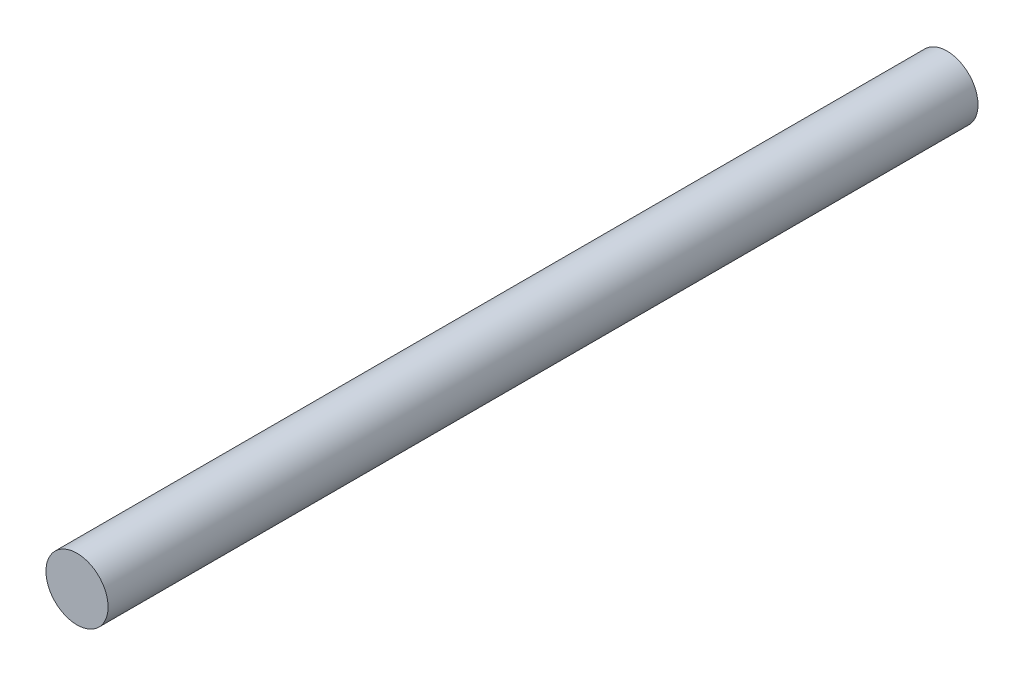
ISO-10303-21;
HEADER;
FILE_DESCRIPTION(('STEP AP214'),'2;1');
FILE_NAME('part.step','',(''),(''),'','','');
FILE_SCHEMA(('AUTOMOTIVE_DESIGN { 1 0 10303 214 1 1 1 1 }'));
ENDSEC;
DATA;
#1=APPLICATION_CONTEXT('core data for automotive mechanical design processes');
#2=APPLICATION_PROTOCOL_DEFINITION('international standard','automotive_design',2000,#1);
#3=PRODUCT_CONTEXT('',#1,'mechanical');
#4=PRODUCT('Part','Part','',(#3));
#5=PRODUCT_RELATED_PRODUCT_CATEGORY('part','',(#4));
#6=PRODUCT_DEFINITION_FORMATION('','',#4);
#7=PRODUCT_DEFINITION_CONTEXT('part definition',#1,'design');
#8=PRODUCT_DEFINITION('design','',#6,#7);
#9=PRODUCT_DEFINITION_SHAPE('','',#8);
#10=(LENGTH_UNIT() NAMED_UNIT(*) SI_UNIT(.MILLI.,.METRE.));
#11=(NAMED_UNIT(*) PLANE_ANGLE_UNIT() SI_UNIT($,.RADIAN.));
#12=(NAMED_UNIT(*) SI_UNIT($,.STERADIAN.) SOLID_ANGLE_UNIT());
#13=UNCERTAINTY_MEASURE_WITH_UNIT(LENGTH_MEASURE(1.E-05),#10,'distance_accuracy_value','');
#14=(GEOMETRIC_REPRESENTATION_CONTEXT(3) GLOBAL_UNCERTAINTY_ASSIGNED_CONTEXT((#13)) GLOBAL_UNIT_ASSIGNED_CONTEXT((#10,
#11,#12)) REPRESENTATION_CONTEXT('',''));
#15=CARTESIAN_POINT('',(0.,0.,0.));
#16=DIRECTION('',(0.,0.,1.));
#17=DIRECTION('',(1.,0.,0.));
#18=AXIS2_PLACEMENT_3D('',#15,#16,#17);
#19=CARTESIAN_POINT('',(0.,0.,70.));
#20=DIRECTION('',(0.,0.,-1.));
#21=DIRECTION('',(-1.,0.,0.));
#22=AXIS2_PLACEMENT_3D('',#19,#20,#21);
#23=CYLINDRICAL_SURFACE('',#22,2.5);
#24=CARTESIAN_POINT('',(0.,0.,70.));
#25=DIRECTION('',(0.,0.,1.));
#26=DIRECTION('',(1.,0.,0.));
#27=AXIS2_PLACEMENT_3D('',#24,#25,#26);
#28=CIRCLE('',#27,2.5);
#29=CARTESIAN_POINT('',(2.5,0.,70.));
#30=VERTEX_POINT('',#29);
#31=EDGE_CURVE('E10',#30,#30,#28,.T.);
#32=ORIENTED_EDGE('',*,*,#31,.F.);
#33=EDGE_LOOP('',(#32));
#34=FACE_BOUND('',#33,.T.);
#35=CARTESIAN_POINT('',(0.,0.,0.));
#36=DIRECTION('',(0.,0.,1.));
#37=DIRECTION('',(1.,0.,0.));
#38=AXIS2_PLACEMENT_3D('',#35,#36,#37);
#39=CIRCLE('',#38,2.5);
#40=CARTESIAN_POINT('',(2.5,0.,0.));
#41=VERTEX_POINT('',#40);
#42=EDGE_CURVE('E35',#41,#41,#39,.T.);
#43=ORIENTED_EDGE('',*,*,#42,.T.);
#44=EDGE_LOOP('',(#43));
#45=FACE_BOUND('',#44,.T.);
#46=ADVANCED_FACE('F32',(#34,#45),#23,.T.);
#47=CARTESIAN_POINT('',(0.,0.,70.));
#48=DIRECTION('',(0.,0.,1.));
#49=DIRECTION('',(1.,0.,0.));
#50=AXIS2_PLACEMENT_3D('',#47,#48,#49);
#51=PLANE('',#50);
#52=ORIENTED_EDGE('',*,*,#31,.T.);
#53=EDGE_LOOP('',(#52));
#54=FACE_BOUND('',#53,.T.);
#55=ADVANCED_FACE('F47',(#54),#51,.T.);
#56=CARTESIAN_POINT('',(0.,0.,0.));
#57=DIRECTION('',(0.,0.,1.));
#58=DIRECTION('',(1.,0.,0.));
#59=AXIS2_PLACEMENT_3D('',#56,#57,#58);
#60=PLANE('',#59);
#61=ORIENTED_EDGE('',*,*,#42,.F.);
#62=EDGE_LOOP('',(#61));
#63=FACE_BOUND('',#62,.T.);
#64=ADVANCED_FACE('F45',(#63),#60,.F.);
#65=CLOSED_SHELL('',(#46,#55,#64));
#66=MANIFOLD_SOLID_BREP('B2',#65);
#67=ADVANCED_BREP_SHAPE_REPRESENTATION('',(#18,#66),#14);
#68=SHAPE_DEFINITION_REPRESENTATION(#9,#67);
ENDSEC;
END-ISO-10303-21;
